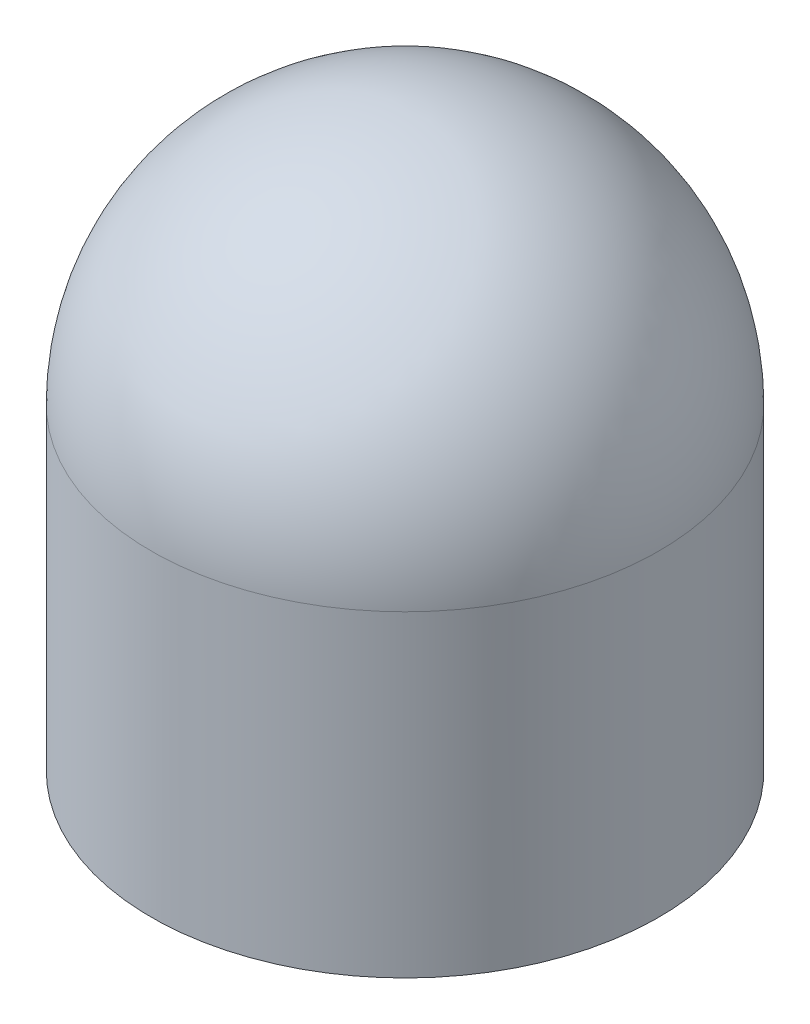
ISO-10303-21;
HEADER;
FILE_DESCRIPTION(('STEP AP214'),'2;1');
FILE_NAME('part.step','',(''),(''),'','','');
FILE_SCHEMA(('AUTOMOTIVE_DESIGN { 1 0 10303 214 1 1 1 1 }'));
ENDSEC;
DATA;
#1=APPLICATION_CONTEXT('core data for automotive mechanical design processes');
#2=APPLICATION_PROTOCOL_DEFINITION('international standard','automotive_design',2000,#1);
#3=PRODUCT_CONTEXT('',#1,'mechanical');
#4=PRODUCT('Part','Part','',(#3));
#5=PRODUCT_RELATED_PRODUCT_CATEGORY('part','',(#4));
#6=PRODUCT_DEFINITION_FORMATION('','',#4);
#7=PRODUCT_DEFINITION_CONTEXT('part definition',#1,'design');
#8=PRODUCT_DEFINITION('design','',#6,#7);
#9=PRODUCT_DEFINITION_SHAPE('','',#8);
#10=(LENGTH_UNIT() NAMED_UNIT(*) SI_UNIT(.MILLI.,.METRE.));
#11=(NAMED_UNIT(*) PLANE_ANGLE_UNIT() SI_UNIT($,.RADIAN.));
#12=(NAMED_UNIT(*) SI_UNIT($,.STERADIAN.) SOLID_ANGLE_UNIT());
#13=UNCERTAINTY_MEASURE_WITH_UNIT(LENGTH_MEASURE(1.E-05),#10,'distance_accuracy_value','');
#14=(GEOMETRIC_REPRESENTATION_CONTEXT(3) GLOBAL_UNCERTAINTY_ASSIGNED_CONTEXT((#13)) GLOBAL_UNIT_ASSIGNED_CONTEXT((#10,
#11,#12)) REPRESENTATION_CONTEXT('',''));
#15=CARTESIAN_POINT('',(0.,0.,0.));
#16=DIRECTION('',(0.,0.,1.));
#17=DIRECTION('',(1.,0.,0.));
#18=AXIS2_PLACEMENT_3D('',#15,#16,#17);
#19=CARTESIAN_POINT('',(0.,12.5,0.));
#20=DIRECTION('',(0.,-1.,0.));
#21=DIRECTION('',(-1.,0.,0.));
#22=AXIS2_PLACEMENT_3D('',#19,#20,#21);
#23=SPHERICAL_SURFACE('',#22,10.);
#24=CARTESIAN_POINT('',(0.,12.5,0.));
#25=DIRECTION('',(0.,-1.,0.));
#26=DIRECTION('',(0.,0.,-1.));
#27=AXIS2_PLACEMENT_3D('',#24,#25,#26);
#28=CIRCLE('',#27,10.);
#29=CARTESIAN_POINT('',(0.,12.5,-10.));
#30=VERTEX_POINT('',#29);
#31=EDGE_CURVE('E10',#30,#30,#28,.T.);
#32=ORIENTED_EDGE('',*,*,#31,.F.);
#33=EDGE_LOOP('',(#32));
#34=FACE_BOUND('',#33,.T.);
#35=ADVANCED_FACE('F36',(#34),#23,.T.);
#36=CARTESIAN_POINT('',(0.,0.,0.));
#37=DIRECTION('',(0.,-1.,0.));
#38=DIRECTION('',(0.,0.,-1.));
#39=AXIS2_PLACEMENT_3D('',#36,#37,#38);
#40=CYLINDRICAL_SURFACE('',#39,10.);
#41=ORIENTED_EDGE('',*,*,#31,.T.);
#42=EDGE_LOOP('',(#41));
#43=FACE_BOUND('',#42,.T.);
#44=CARTESIAN_POINT('',(0.,0.,0.));
#45=DIRECTION('',(0.,-1.,0.));
#46=DIRECTION('',(0.,0.,-1.));
#47=AXIS2_PLACEMENT_3D('',#44,#45,#46);
#48=CIRCLE('',#47,10.);
#49=CARTESIAN_POINT('',(0.,0.,-10.));
#50=VERTEX_POINT('',#49);
#51=EDGE_CURVE('E42',#50,#50,#48,.T.);
#52=ORIENTED_EDGE('',*,*,#51,.F.);
#53=EDGE_LOOP('',(#52));
#54=FACE_BOUND('',#53,.T.);
#55=ADVANCED_FACE('F60',(#43,#54),#40,.T.);
#56=CARTESIAN_POINT('',(0.,0.,0.));
#57=DIRECTION('',(0.,-1.,0.));
#58=DIRECTION('',(0.,0.,-1.));
#59=AXIS2_PLACEMENT_3D('',#56,#57,#58);
#60=PLANE('',#59);
#61=CARTESIAN_POINT('',(0.,0.,0.));
#62=DIRECTION('',(0.,-1.,0.));
#63=DIRECTION('',(0.,0.,-1.));
#64=AXIS2_PLACEMENT_3D('',#61,#62,#63);
#65=CIRCLE('',#64,5.);
#66=CARTESIAN_POINT('',(0.,0.,-5.));
#67=VERTEX_POINT('',#66);
#68=EDGE_CURVE('E50',#67,#67,#65,.T.);
#69=ORIENTED_EDGE('',*,*,#68,.F.);
#70=EDGE_LOOP('',(#69));
#71=FACE_BOUND('',#70,.T.);
#72=ORIENTED_EDGE('',*,*,#51,.T.);
#73=EDGE_LOOP('',(#72));
#74=FACE_BOUND('',#73,.T.);
#75=ADVANCED_FACE('F58',(#71,#74),#60,.T.);
#76=CARTESIAN_POINT('',(0.,12.5,0.));
#77=DIRECTION('',(0.,-1.,0.));
#78=DIRECTION('',(0.,0.,-1.));
#79=AXIS2_PLACEMENT_3D('',#76,#77,#78);
#80=CYLINDRICAL_SURFACE('',#79,5.);
#81=CARTESIAN_POINT('',(0.,12.5,0.));
#82=DIRECTION('',(0.,-1.,0.));
#83=DIRECTION('',(0.,0.,-1.));
#84=AXIS2_PLACEMENT_3D('',#81,#82,#83);
#85=CIRCLE('',#84,5.);
#86=CARTESIAN_POINT('',(0.,12.5,-5.));
#87=VERTEX_POINT('',#86);
#88=EDGE_CURVE('E46',#87,#87,#85,.T.);
#89=ORIENTED_EDGE('',*,*,#88,.F.);
#90=EDGE_LOOP('',(#89));
#91=FACE_BOUND('',#90,.T.);
#92=ORIENTED_EDGE('',*,*,#68,.T.);
#93=EDGE_LOOP('',(#92));
#94=FACE_BOUND('',#93,.T.);
#95=ADVANCED_FACE('F56',(#91,#94),#80,.F.);
#96=CARTESIAN_POINT('',(0.,12.5,0.));
#97=DIRECTION('',(0.,-1.,0.));
#98=DIRECTION('',(0.,0.,-1.));
#99=AXIS2_PLACEMENT_3D('',#96,#97,#98);
#100=PLANE('',#99);
#101=ORIENTED_EDGE('',*,*,#88,.T.);
#102=EDGE_LOOP('',(#101));
#103=FACE_BOUND('',#102,.T.);
#104=ADVANCED_FACE('F66',(#103),#100,.T.);
#105=CLOSED_SHELL('',(#35,#55,#75,#95,#104));
#106=MANIFOLD_SOLID_BREP('B2',#105);
#107=ADVANCED_BREP_SHAPE_REPRESENTATION('',(#18,#106),#14);
#108=SHAPE_DEFINITION_REPRESENTATION(#9,#107);
ENDSEC;
END-ISO-10303-21;
